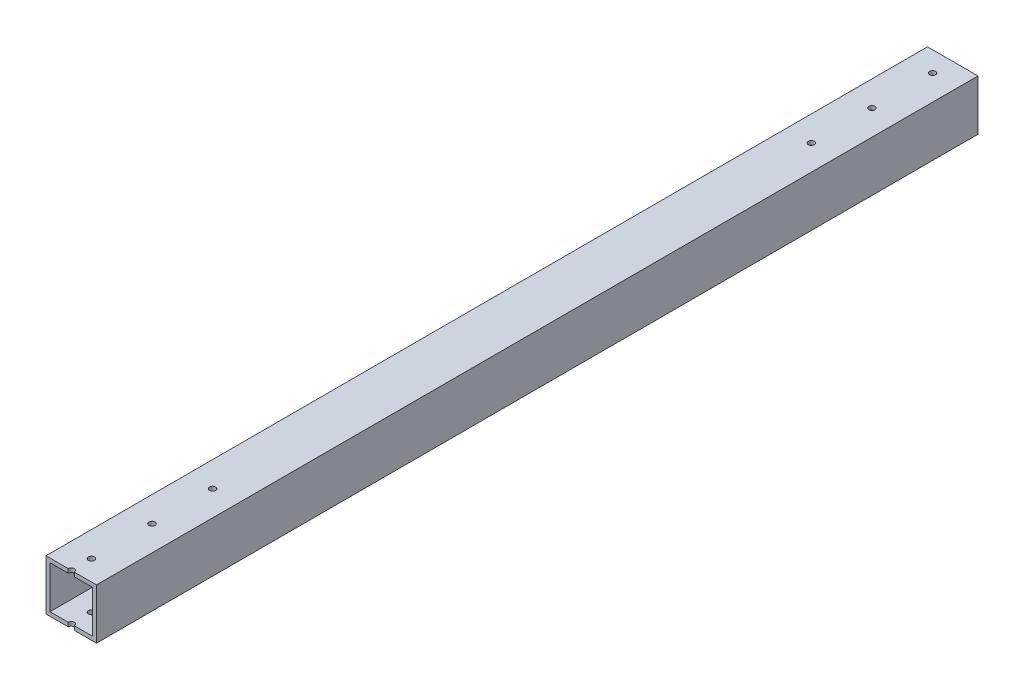
ISO-10303-21;
HEADER;
FILE_DESCRIPTION(('STEP AP214'),'2;1');
FILE_NAME('part.step','',(''),(''),'','','');
FILE_SCHEMA(('AUTOMOTIVE_DESIGN { 1 0 10303 214 1 1 1 1 }'));
ENDSEC;
DATA;
#1=APPLICATION_CONTEXT('core data for automotive mechanical design processes');
#2=APPLICATION_PROTOCOL_DEFINITION('international standard','automotive_design',2000,#1);
#3=PRODUCT_CONTEXT('',#1,'mechanical');
#4=PRODUCT('Part','Part','',(#3));
#5=PRODUCT_RELATED_PRODUCT_CATEGORY('part','',(#4));
#6=PRODUCT_DEFINITION_FORMATION('','',#4);
#7=PRODUCT_DEFINITION_CONTEXT('part definition',#1,'design');
#8=PRODUCT_DEFINITION('design','',#6,#7);
#9=PRODUCT_DEFINITION_SHAPE('','',#8);
#10=(LENGTH_UNIT() NAMED_UNIT(*) SI_UNIT(.MILLI.,.METRE.));
#11=(NAMED_UNIT(*) PLANE_ANGLE_UNIT() SI_UNIT($,.RADIAN.));
#12=(NAMED_UNIT(*) SI_UNIT($,.STERADIAN.) SOLID_ANGLE_UNIT());
#13=UNCERTAINTY_MEASURE_WITH_UNIT(LENGTH_MEASURE(1.E-05),#10,'distance_accuracy_value','');
#14=(GEOMETRIC_REPRESENTATION_CONTEXT(3) GLOBAL_UNCERTAINTY_ASSIGNED_CONTEXT((#13)) GLOBAL_UNIT_ASSIGNED_CONTEXT((#10,
#11,#12)) REPRESENTATION_CONTEXT('',''));
#15=CARTESIAN_POINT('',(0.,0.,0.));
#16=DIRECTION('',(0.,0.,1.));
#17=DIRECTION('',(1.,0.,0.));
#18=AXIS2_PLACEMENT_3D('',#15,#16,#17);
#19=CARTESIAN_POINT('',(0.,0.,0.));
#20=DIRECTION('',(0.,0.,-1.));
#21=DIRECTION('',(-1.,0.,0.));
#22=AXIS2_PLACEMENT_3D('',#19,#20,#21);
#23=PLANE('',#22);
#24=DIRECTION('',(1.,0.,0.));
#25=VECTOR('',#24,1.);
#26=CARTESIAN_POINT('',(-12.5,-12.5,0.));
#27=LINE('',#26,#25);
#28=CARTESIAN_POINT('',(-12.5,-12.5,0.));
#29=VERTEX_POINT('',#28);
#30=CARTESIAN_POINT('',(-1.5,-12.5,0.));
#31=VERTEX_POINT('',#30);
#32=EDGE_CURVE('E269',#29,#31,#27,.T.);
#33=ORIENTED_EDGE('',*,*,#32,.T.);
#34=DIRECTION('',(0.,1.,0.));
#35=VECTOR('',#34,1.);
#36=CARTESIAN_POINT('',(-1.5,-416.5,0.));
#37=LINE('',#36,#35);
#38=CARTESIAN_POINT('',(-1.5,-10.5,0.));
#39=VERTEX_POINT('',#38);
#40=EDGE_CURVE('E195',#31,#39,#37,.T.);
#41=ORIENTED_EDGE('',*,*,#40,.T.);
#42=DIRECTION('',(1.,0.,0.));
#43=VECTOR('',#42,1.);
#44=CARTESIAN_POINT('',(-10.5,-10.5,0.));
#45=LINE('',#44,#43);
#46=CARTESIAN_POINT('',(-10.5,-10.5,0.));
#47=VERTEX_POINT('',#46);
#48=EDGE_CURVE('E241',#47,#39,#45,.T.);
#49=ORIENTED_EDGE('',*,*,#48,.F.);
#50=DIRECTION('',(0.,-1.,0.));
#51=VECTOR('',#50,1.);
#52=CARTESIAN_POINT('',(-10.5,-10.5,0.));
#53=LINE('',#52,#51);
#54=CARTESIAN_POINT('',(-10.5,10.5,0.));
#55=VERTEX_POINT('',#54);
#56=EDGE_CURVE('E224',#55,#47,#53,.T.);
#57=ORIENTED_EDGE('',*,*,#56,.F.);
#58=DIRECTION('',(-1.,0.,0.));
#59=VECTOR('',#58,1.);
#60=CARTESIAN_POINT('',(-10.5,10.5,0.));
#61=LINE('',#60,#59);
#62=CARTESIAN_POINT('',(-1.5,10.5,0.));
#63=VERTEX_POINT('',#62);
#64=EDGE_CURVE('E247',#63,#55,#61,.T.);
#65=ORIENTED_EDGE('',*,*,#64,.F.);
#66=CARTESIAN_POINT('',(-1.5,12.5,0.));
#67=VERTEX_POINT('',#66);
#68=EDGE_CURVE('E49',#63,#67,#37,.T.);
#69=ORIENTED_EDGE('',*,*,#68,.T.);
#70=DIRECTION('',(-1.,0.,0.));
#71=VECTOR('',#70,1.);
#72=CARTESIAN_POINT('',(-12.5,12.5,0.));
#73=LINE('',#72,#71);
#74=CARTESIAN_POINT('',(-12.5,12.5,0.));
#75=VERTEX_POINT('',#74);
#76=EDGE_CURVE('E137',#67,#75,#73,.T.);
#77=ORIENTED_EDGE('',*,*,#76,.T.);
#78=DIRECTION('',(0.,-1.,0.));
#79=VECTOR('',#78,1.);
#80=CARTESIAN_POINT('',(-12.5,-12.5,0.));
#81=LINE('',#80,#79);
#82=EDGE_CURVE('E252',#75,#29,#81,.T.);
#83=ORIENTED_EDGE('',*,*,#82,.T.);
#84=EDGE_LOOP('',(#33,#41,#49,#57,#65,#69,#77,#83));
#85=FACE_BOUND('',#84,.T.);
#86=ADVANCED_FACE('F32',(#85),#23,.F.);
#87=CARTESIAN_POINT('',(-12.5,-12.5,-436.5));
#88=DIRECTION('',(-1.,0.,0.));
#89=DIRECTION('',(0.,-1.,0.));
#90=AXIS2_PLACEMENT_3D('',#87,#88,#89);
#91=PLANE('',#90);
#92=ORIENTED_EDGE('',*,*,#82,.F.);
#93=DIRECTION('',(0.,0.,1.));
#94=VECTOR('',#93,1.);
#95=CARTESIAN_POINT('',(-12.5,12.5,-436.5));
#96=LINE('',#95,#94);
#97=CARTESIAN_POINT('',(-12.5,12.5,-436.5));
#98=VERTEX_POINT('',#97);
#99=EDGE_CURVE('E41',#98,#75,#96,.T.);
#100=ORIENTED_EDGE('',*,*,#99,.F.);
#101=DIRECTION('',(0.,-1.,0.));
#102=VECTOR('',#101,1.);
#103=CARTESIAN_POINT('',(-12.5,-12.5,-436.5));
#104=LINE('',#103,#102);
#105=CARTESIAN_POINT('',(-12.5,-12.5,-436.5));
#106=VERTEX_POINT('',#105);
#107=EDGE_CURVE('E144',#98,#106,#104,.T.);
#108=ORIENTED_EDGE('',*,*,#107,.T.);
#109=DIRECTION('',(0.,0.,1.));
#110=VECTOR('',#109,1.);
#111=CARTESIAN_POINT('',(-12.5,-12.5,-436.5));
#112=LINE('',#111,#110);
#113=EDGE_CURVE('E158',#106,#29,#112,.T.);
#114=ORIENTED_EDGE('',*,*,#113,.T.);
#115=EDGE_LOOP('',(#92,#100,#108,#114));
#116=FACE_BOUND('',#115,.T.);
#117=ADVANCED_FACE('F34',(#116),#91,.T.);
#118=CARTESIAN_POINT('',(-12.5,12.5,-436.5));
#119=DIRECTION('',(0.,1.,0.));
#120=DIRECTION('',(0.,0.,1.));
#121=AXIS2_PLACEMENT_3D('',#118,#119,#120);
#122=PLANE('',#121);
#123=CARTESIAN_POINT('',(0.,12.5,-70.0000000000001));
#124=DIRECTION('',(0.,-1.,0.));
#125=DIRECTION('',(0.,0.,-1.));
#126=AXIS2_PLACEMENT_3D('',#123,#124,#125);
#127=CIRCLE('',#126,1.5);
#128=CARTESIAN_POINT('',(0.,12.5,-71.5000000000001));
#129=VERTEX_POINT('',#128);
#130=EDGE_CURVE('E539',#129,#129,#127,.T.);
#131=ORIENTED_EDGE('',*,*,#130,.T.);
#132=EDGE_LOOP('',(#131));
#133=FACE_BOUND('',#132,.T.);
#134=CARTESIAN_POINT('',(0.,12.5,-40.));
#135=DIRECTION('',(0.,-1.,0.));
#136=DIRECTION('',(0.,0.,-1.));
#137=AXIS2_PLACEMENT_3D('',#134,#135,#136);
#138=CIRCLE('',#137,1.5);
#139=CARTESIAN_POINT('',(0.,12.5,-41.5));
#140=VERTEX_POINT('',#139);
#141=EDGE_CURVE('E558',#140,#140,#138,.T.);
#142=ORIENTED_EDGE('',*,*,#141,.T.);
#143=EDGE_LOOP('',(#142));
#144=FACE_BOUND('',#143,.T.);
#145=CARTESIAN_POINT('',(0.,12.5,-10.));
#146=DIRECTION('',(0.,-1.,0.));
#147=DIRECTION('',(0.,0.,-1.));
#148=AXIS2_PLACEMENT_3D('',#145,#146,#147);
#149=CIRCLE('',#148,1.5);
#150=CARTESIAN_POINT('',(0.,12.5,-11.5));
#151=VERTEX_POINT('',#150);
#152=EDGE_CURVE('E190',#151,#151,#149,.T.);
#153=ORIENTED_EDGE('',*,*,#152,.T.);
#154=EDGE_LOOP('',(#153));
#155=FACE_BOUND('',#154,.T.);
#156=CARTESIAN_POINT('',(0.,12.5,0.));
#157=DIRECTION('',(0.,1.,0.));
#158=DIRECTION('',(0.,0.,1.));
#159=AXIS2_PLACEMENT_3D('',#156,#157,#158);
#160=CIRCLE('',#159,1.5);
#161=CARTESIAN_POINT('',(1.5,12.5,0.));
#162=VERTEX_POINT('',#161);
#163=EDGE_CURVE('E123',#162,#67,#160,.T.);
#164=ORIENTED_EDGE('',*,*,#163,.F.);
#165=CARTESIAN_POINT('',(12.5,12.5,0.));
#166=VERTEX_POINT('',#165);
#167=EDGE_CURVE('E135',#166,#162,#73,.T.);
#168=ORIENTED_EDGE('',*,*,#167,.F.);
#169=DIRECTION('',(0.,0.,1.));
#170=VECTOR('',#169,1.);
#171=CARTESIAN_POINT('',(12.5,12.5,-436.5));
#172=LINE('',#171,#170);
#173=CARTESIAN_POINT('',(12.5,12.5,-436.5));
#174=VERTEX_POINT('',#173);
#175=EDGE_CURVE('E153',#174,#166,#172,.T.);
#176=ORIENTED_EDGE('',*,*,#175,.F.);
#177=DIRECTION('',(-1.,0.,0.));
#178=VECTOR('',#177,1.);
#179=CARTESIAN_POINT('',(-12.5,12.5,-436.5));
#180=LINE('',#179,#178);
#181=EDGE_CURVE('E160',#174,#98,#180,.T.);
#182=ORIENTED_EDGE('',*,*,#181,.T.);
#183=ORIENTED_EDGE('',*,*,#99,.T.);
#184=ORIENTED_EDGE('',*,*,#76,.F.);
#185=EDGE_LOOP('',(#164,#168,#176,#182,#183,#184));
#186=FACE_BOUND('',#185,.T.);
#187=CARTESIAN_POINT('',(0.,12.5,-366.5));
#188=DIRECTION('',(0.,1.,0.));
#189=DIRECTION('',(0.,0.,1.));
#190=AXIS2_PLACEMENT_3D('',#187,#188,#189);
#191=CIRCLE('',#190,1.5);
#192=CARTESIAN_POINT('',(0.,12.5,-365.));
#193=VERTEX_POINT('',#192);
#194=EDGE_CURVE('E203',#193,#193,#191,.T.);
#195=ORIENTED_EDGE('',*,*,#194,.F.);
#196=EDGE_LOOP('',(#195));
#197=FACE_BOUND('',#196,.T.);
#198=CARTESIAN_POINT('',(0.,12.5,-396.5));
#199=DIRECTION('',(0.,1.,0.));
#200=DIRECTION('',(0.,0.,1.));
#201=AXIS2_PLACEMENT_3D('',#198,#199,#200);
#202=CIRCLE('',#201,1.5);
#203=CARTESIAN_POINT('',(0.,12.5,-395.));
#204=VERTEX_POINT('',#203);
#205=EDGE_CURVE('E206',#204,#204,#202,.T.);
#206=ORIENTED_EDGE('',*,*,#205,.F.);
#207=EDGE_LOOP('',(#206));
#208=FACE_BOUND('',#207,.T.);
#209=CARTESIAN_POINT('',(0.,12.5,-426.5));
#210=DIRECTION('',(0.,1.,0.));
#211=DIRECTION('',(0.,0.,1.));
#212=AXIS2_PLACEMENT_3D('',#209,#210,#211);
#213=CIRCLE('',#212,1.5);
#214=CARTESIAN_POINT('',(0.,12.5,-425.));
#215=VERTEX_POINT('',#214);
#216=EDGE_CURVE('E212',#215,#215,#213,.T.);
#217=ORIENTED_EDGE('',*,*,#216,.F.);
#218=EDGE_LOOP('',(#217));
#219=FACE_BOUND('',#218,.T.);
#220=ADVANCED_FACE('F133',(#133,#144,#155,#186,#197,#208,#219),#122,.T.);
#221=CARTESIAN_POINT('',(12.5,-12.5,-436.5));
#222=DIRECTION('',(1.,0.,0.));
#223=DIRECTION('',(0.,1.,0.));
#224=AXIS2_PLACEMENT_3D('',#221,#222,#223);
#225=PLANE('',#224);
#226=DIRECTION('',(0.,1.,0.));
#227=VECTOR('',#226,1.);
#228=CARTESIAN_POINT('',(12.5,-12.5,0.));
#229=LINE('',#228,#227);
#230=CARTESIAN_POINT('',(12.5,-12.5,0.));
#231=VERTEX_POINT('',#230);
#232=EDGE_CURVE('E143',#231,#166,#229,.T.);
#233=ORIENTED_EDGE('',*,*,#232,.F.);
#234=DIRECTION('',(0.,0.,1.));
#235=VECTOR('',#234,1.);
#236=CARTESIAN_POINT('',(12.5,-12.5,-436.5));
#237=LINE('',#236,#235);
#238=CARTESIAN_POINT('',(12.5,-12.5,-436.5));
#239=VERTEX_POINT('',#238);
#240=EDGE_CURVE('E155',#239,#231,#237,.T.);
#241=ORIENTED_EDGE('',*,*,#240,.F.);
#242=DIRECTION('',(0.,1.,0.));
#243=VECTOR('',#242,1.);
#244=CARTESIAN_POINT('',(12.5,-12.5,-436.5));
#245=LINE('',#244,#243);
#246=EDGE_CURVE('E262',#239,#174,#245,.T.);
#247=ORIENTED_EDGE('',*,*,#246,.T.);
#248=ORIENTED_EDGE('',*,*,#175,.T.);
#249=EDGE_LOOP('',(#233,#241,#247,#248));
#250=FACE_BOUND('',#249,.T.);
#251=ADVANCED_FACE('F282',(#250),#225,.T.);
#252=CARTESIAN_POINT('',(-12.5,-12.5,-436.5));
#253=DIRECTION('',(0.,-1.,0.));
#254=DIRECTION('',(1.,0.,0.));
#255=AXIS2_PLACEMENT_3D('',#252,#253,#254);
#256=PLANE('',#255);
#257=CARTESIAN_POINT('',(0.,-12.5,-70.0000000000001));
#258=DIRECTION('',(0.,-1.,0.));
#259=DIRECTION('',(0.,0.,-1.));
#260=AXIS2_PLACEMENT_3D('',#257,#258,#259);
#261=CIRCLE('',#260,1.5);
#262=CARTESIAN_POINT('',(0.,-12.5,-71.5000000000001));
#263=VERTEX_POINT('',#262);
#264=EDGE_CURVE('E177',#263,#263,#261,.T.);
#265=ORIENTED_EDGE('',*,*,#264,.F.);
#266=EDGE_LOOP('',(#265));
#267=FACE_BOUND('',#266,.T.);
#268=CARTESIAN_POINT('',(0.,-12.5,-40.));
#269=DIRECTION('',(0.,-1.,0.));
#270=DIRECTION('',(0.,0.,-1.));
#271=AXIS2_PLACEMENT_3D('',#268,#269,#270);
#272=CIRCLE('',#271,1.5);
#273=CARTESIAN_POINT('',(0.,-12.5,-41.5));
#274=VERTEX_POINT('',#273);
#275=EDGE_CURVE('E553',#274,#274,#272,.T.);
#276=ORIENTED_EDGE('',*,*,#275,.F.);
#277=EDGE_LOOP('',(#276));
#278=FACE_BOUND('',#277,.T.);
#279=CARTESIAN_POINT('',(0.,-12.5,-10.));
#280=DIRECTION('',(0.,-1.,0.));
#281=DIRECTION('',(0.,0.,-1.));
#282=AXIS2_PLACEMENT_3D('',#279,#280,#281);
#283=CIRCLE('',#282,1.5);
#284=CARTESIAN_POINT('',(0.,-12.5,-11.5));
#285=VERTEX_POINT('',#284);
#286=EDGE_CURVE('E562',#285,#285,#283,.T.);
#287=ORIENTED_EDGE('',*,*,#286,.F.);
#288=EDGE_LOOP('',(#287));
#289=FACE_BOUND('',#288,.T.);
#290=CARTESIAN_POINT('',(0.,-12.5,0.));
#291=DIRECTION('',(0.,-1.,0.));
#292=DIRECTION('',(1.,0.,0.));
#293=AXIS2_PLACEMENT_3D('',#290,#291,#292);
#294=CIRCLE('',#293,1.5);
#295=CARTESIAN_POINT('',(1.5,-12.5,0.));
#296=VERTEX_POINT('',#295);
#297=EDGE_CURVE('E198',#31,#296,#294,.T.);
#298=ORIENTED_EDGE('',*,*,#297,.F.);
#299=ORIENTED_EDGE('',*,*,#32,.F.);
#300=ORIENTED_EDGE('',*,*,#113,.F.);
#301=DIRECTION('',(1.,0.,0.));
#302=VECTOR('',#301,1.);
#303=CARTESIAN_POINT('',(-12.5,-12.5,-436.5));
#304=LINE('',#303,#302);
#305=EDGE_CURVE('E147',#106,#239,#304,.T.);
#306=ORIENTED_EDGE('',*,*,#305,.T.);
#307=ORIENTED_EDGE('',*,*,#240,.T.);
#308=EDGE_CURVE('E268',#296,#231,#27,.T.);
#309=ORIENTED_EDGE('',*,*,#308,.F.);
#310=EDGE_LOOP('',(#298,#299,#300,#306,#307,#309));
#311=FACE_BOUND('',#310,.T.);
#312=CARTESIAN_POINT('',(0.,-12.5,-366.5));
#313=DIRECTION('',(0.,1.,0.));
#314=DIRECTION('',(0.,0.,1.));
#315=AXIS2_PLACEMENT_3D('',#312,#313,#314);
#316=CIRCLE('',#315,1.5);
#317=CARTESIAN_POINT('',(0.,-12.5,-365.));
#318=VERTEX_POINT('',#317);
#319=EDGE_CURVE('E165',#318,#318,#316,.T.);
#320=ORIENTED_EDGE('',*,*,#319,.T.);
#321=EDGE_LOOP('',(#320));
#322=FACE_BOUND('',#321,.T.);
#323=CARTESIAN_POINT('',(0.,-12.5,-396.5));
#324=DIRECTION('',(0.,1.,0.));
#325=DIRECTION('',(0.,0.,1.));
#326=AXIS2_PLACEMENT_3D('',#323,#324,#325);
#327=CIRCLE('',#326,1.5);
#328=CARTESIAN_POINT('',(0.,-12.5,-395.));
#329=VERTEX_POINT('',#328);
#330=EDGE_CURVE('E209',#329,#329,#327,.T.);
#331=ORIENTED_EDGE('',*,*,#330,.T.);
#332=EDGE_LOOP('',(#331));
#333=FACE_BOUND('',#332,.T.);
#334=CARTESIAN_POINT('',(0.,-12.5,-426.5));
#335=DIRECTION('',(0.,1.,0.));
#336=DIRECTION('',(0.,0.,1.));
#337=AXIS2_PLACEMENT_3D('',#334,#335,#336);
#338=CIRCLE('',#337,1.5);
#339=CARTESIAN_POINT('',(0.,-12.5,-425.));
#340=VERTEX_POINT('',#339);
#341=EDGE_CURVE('E215',#340,#340,#338,.T.);
#342=ORIENTED_EDGE('',*,*,#341,.T.);
#343=EDGE_LOOP('',(#342));
#344=FACE_BOUND('',#343,.T.);
#345=ADVANCED_FACE('F277',(#267,#278,#289,#311,#322,#333,#344),#256,.T.);
#346=CARTESIAN_POINT('',(0.,0.,-436.5));
#347=DIRECTION('',(0.,0.,-1.));
#348=DIRECTION('',(-1.,0.,0.));
#349=AXIS2_PLACEMENT_3D('',#346,#347,#348);
#350=PLANE('',#349);
#351=DIRECTION('',(0.,-1.,0.));
#352=VECTOR('',#351,1.);
#353=CARTESIAN_POINT('',(-10.5,-10.5,-436.5));
#354=LINE('',#353,#352);
#355=CARTESIAN_POINT('',(-10.5,10.5,-436.5));
#356=VERTEX_POINT('',#355);
#357=CARTESIAN_POINT('',(-10.5,-10.5,-436.5));
#358=VERTEX_POINT('',#357);
#359=EDGE_CURVE('E225',#356,#358,#354,.T.);
#360=ORIENTED_EDGE('',*,*,#359,.T.);
#361=DIRECTION('',(1.,0.,0.));
#362=VECTOR('',#361,1.);
#363=CARTESIAN_POINT('',(-10.5,-10.5,-436.5));
#364=LINE('',#363,#362);
#365=CARTESIAN_POINT('',(10.5,-10.5,-436.5));
#366=VERTEX_POINT('',#365);
#367=EDGE_CURVE('E228',#358,#366,#364,.T.);
#368=ORIENTED_EDGE('',*,*,#367,.T.);
#369=DIRECTION('',(0.,1.,0.));
#370=VECTOR('',#369,1.);
#371=CARTESIAN_POINT('',(10.5,-10.5,-436.5));
#372=LINE('',#371,#370);
#373=CARTESIAN_POINT('',(10.5,10.5,-436.5));
#374=VERTEX_POINT('',#373);
#375=EDGE_CURVE('E232',#366,#374,#372,.T.);
#376=ORIENTED_EDGE('',*,*,#375,.T.);
#377=DIRECTION('',(-1.,0.,0.));
#378=VECTOR('',#377,1.);
#379=CARTESIAN_POINT('',(-10.5,10.5,-436.5));
#380=LINE('',#379,#378);
#381=EDGE_CURVE('E235',#374,#356,#380,.T.);
#382=ORIENTED_EDGE('',*,*,#381,.T.);
#383=EDGE_LOOP('',(#360,#368,#376,#382));
#384=FACE_BOUND('',#383,.T.);
#385=ORIENTED_EDGE('',*,*,#107,.F.);
#386=ORIENTED_EDGE('',*,*,#181,.F.);
#387=ORIENTED_EDGE('',*,*,#246,.F.);
#388=ORIENTED_EDGE('',*,*,#305,.F.);
#389=EDGE_LOOP('',(#385,#386,#387,#388));
#390=FACE_BOUND('',#389,.T.);
#391=ADVANCED_FACE('F287',(#384,#390),#350,.T.);
#392=ORIENTED_EDGE('',*,*,#167,.T.);
#393=DIRECTION('',(0.,1.,0.));
#394=VECTOR('',#393,1.);
#395=CARTESIAN_POINT('',(1.5,-416.5,0.));
#396=LINE('',#395,#394);
#397=CARTESIAN_POINT('',(1.5,10.5,0.));
#398=VERTEX_POINT('',#397);
#399=EDGE_CURVE('E120',#162,#398,#396,.F.);
#400=ORIENTED_EDGE('',*,*,#399,.T.);
#401=CARTESIAN_POINT('',(10.5,10.5,0.));
#402=VERTEX_POINT('',#401);
#403=EDGE_CURVE('E229',#402,#398,#61,.T.);
#404=ORIENTED_EDGE('',*,*,#403,.F.);
#405=DIRECTION('',(0.,1.,0.));
#406=VECTOR('',#405,1.);
#407=CARTESIAN_POINT('',(10.5,-10.5,0.));
#408=LINE('',#407,#406);
#409=CARTESIAN_POINT('',(10.5,-10.5,0.));
#410=VERTEX_POINT('',#409);
#411=EDGE_CURVE('E244',#410,#402,#408,.T.);
#412=ORIENTED_EDGE('',*,*,#411,.F.);
#413=CARTESIAN_POINT('',(1.5,-10.5,0.));
#414=VERTEX_POINT('',#413);
#415=EDGE_CURVE('E240',#414,#410,#45,.T.);
#416=ORIENTED_EDGE('',*,*,#415,.F.);
#417=EDGE_CURVE('E57',#414,#296,#396,.F.);
#418=ORIENTED_EDGE('',*,*,#417,.T.);
#419=ORIENTED_EDGE('',*,*,#308,.T.);
#420=ORIENTED_EDGE('',*,*,#232,.T.);
#421=EDGE_LOOP('',(#392,#400,#404,#412,#416,#418,#419,#420));
#422=FACE_BOUND('',#421,.T.);
#423=ADVANCED_FACE('F141',(#422),#23,.F.);
#424=CARTESIAN_POINT('',(-10.5,-10.5,-436.5));
#425=DIRECTION('',(-1.,0.,0.));
#426=DIRECTION('',(0.,-1.,0.));
#427=AXIS2_PLACEMENT_3D('',#424,#425,#426);
#428=PLANE('',#427);
#429=ORIENTED_EDGE('',*,*,#56,.T.);
#430=DIRECTION('',(0.,0.,1.));
#431=VECTOR('',#430,1.);
#432=CARTESIAN_POINT('',(-10.5,-10.5,-436.5));
#433=LINE('',#432,#431);
#434=EDGE_CURVE('E238',#358,#47,#433,.T.);
#435=ORIENTED_EDGE('',*,*,#434,.F.);
#436=ORIENTED_EDGE('',*,*,#359,.F.);
#437=DIRECTION('',(0.,0.,1.));
#438=VECTOR('',#437,1.);
#439=CARTESIAN_POINT('',(-10.5,10.5,-436.5));
#440=LINE('',#439,#438);
#441=EDGE_CURVE('E249',#356,#55,#440,.T.);
#442=ORIENTED_EDGE('',*,*,#441,.T.);
#443=EDGE_LOOP('',(#429,#435,#436,#442));
#444=FACE_BOUND('',#443,.T.);
#445=ADVANCED_FACE('F297',(#444),#428,.F.);
#446=CARTESIAN_POINT('',(-10.5,10.5,-436.5));
#447=DIRECTION('',(0.,1.,0.));
#448=DIRECTION('',(-1.,0.,0.));
#449=AXIS2_PLACEMENT_3D('',#446,#447,#448);
#450=PLANE('',#449);
#451=CARTESIAN_POINT('',(0.,10.5,-70.0000000000001));
#452=DIRECTION('',(0.,1.,0.));
#453=DIRECTION('',(-1.,0.,0.));
#454=AXIS2_PLACEMENT_3D('',#451,#452,#453);
#455=CIRCLE('',#454,1.5);
#456=CARTESIAN_POINT('',(-1.5,10.5,-70.0000000000001));
#457=VERTEX_POINT('',#456);
#458=EDGE_CURVE('E138',#457,#457,#455,.F.);
#459=ORIENTED_EDGE('',*,*,#458,.F.);
#460=EDGE_LOOP('',(#459));
#461=FACE_BOUND('',#460,.T.);
#462=CARTESIAN_POINT('',(0.,10.5,-40.));
#463=DIRECTION('',(0.,1.,0.));
#464=DIRECTION('',(-1.,0.,0.));
#465=AXIS2_PLACEMENT_3D('',#462,#463,#464);
#466=CIRCLE('',#465,1.5);
#467=CARTESIAN_POINT('',(-1.5,10.5,-40.));
#468=VERTEX_POINT('',#467);
#469=EDGE_CURVE('E180',#468,#468,#466,.F.);
#470=ORIENTED_EDGE('',*,*,#469,.F.);
#471=EDGE_LOOP('',(#470));
#472=FACE_BOUND('',#471,.T.);
#473=CARTESIAN_POINT('',(0.,10.5,-10.));
#474=DIRECTION('',(0.,1.,0.));
#475=DIRECTION('',(-1.,0.,0.));
#476=AXIS2_PLACEMENT_3D('',#473,#474,#475);
#477=CIRCLE('',#476,1.5);
#478=CARTESIAN_POINT('',(-1.5,10.5,-10.));
#479=VERTEX_POINT('',#478);
#480=EDGE_CURVE('E176',#479,#479,#477,.F.);
#481=ORIENTED_EDGE('',*,*,#480,.F.);
#482=EDGE_LOOP('',(#481));
#483=FACE_BOUND('',#482,.T.);
#484=CARTESIAN_POINT('',(0.,10.5,-366.5));
#485=DIRECTION('',(0.,1.,0.));
#486=DIRECTION('',(-1.,0.,0.));
#487=AXIS2_PLACEMENT_3D('',#484,#485,#486);
#488=CIRCLE('',#487,1.5);
#489=CARTESIAN_POINT('',(-1.5,10.5,-366.5));
#490=VERTEX_POINT('',#489);
#491=EDGE_CURVE('E172',#490,#490,#488,.T.);
#492=ORIENTED_EDGE('',*,*,#491,.T.);
#493=EDGE_LOOP('',(#492));
#494=FACE_BOUND('',#493,.T.);
#495=CARTESIAN_POINT('',(0.,10.5,-396.5));
#496=DIRECTION('',(0.,1.,0.));
#497=DIRECTION('',(-1.,0.,0.));
#498=AXIS2_PLACEMENT_3D('',#495,#496,#497);
#499=CIRCLE('',#498,1.5);
#500=CARTESIAN_POINT('',(-1.5,10.5,-396.5));
#501=VERTEX_POINT('',#500);
#502=EDGE_CURVE('E169',#501,#501,#499,.T.);
#503=ORIENTED_EDGE('',*,*,#502,.T.);
#504=EDGE_LOOP('',(#503));
#505=FACE_BOUND('',#504,.T.);
#506=CARTESIAN_POINT('',(0.,10.5,-426.5));
#507=DIRECTION('',(0.,1.,0.));
#508=DIRECTION('',(-1.,0.,0.));
#509=AXIS2_PLACEMENT_3D('',#506,#507,#508);
#510=CIRCLE('',#509,1.5);
#511=CARTESIAN_POINT('',(-1.5,10.5,-426.5));
#512=VERTEX_POINT('',#511);
#513=EDGE_CURVE('E164',#512,#512,#510,.T.);
#514=ORIENTED_EDGE('',*,*,#513,.T.);
#515=EDGE_LOOP('',(#514));
#516=FACE_BOUND('',#515,.T.);
#517=ORIENTED_EDGE('',*,*,#403,.T.);
#518=CARTESIAN_POINT('',(0.,10.5,0.));
#519=DIRECTION('',(0.,1.,0.));
#520=DIRECTION('',(-1.,0.,0.));
#521=AXIS2_PLACEMENT_3D('',#518,#519,#520);
#522=CIRCLE('',#521,1.5);
#523=EDGE_CURVE('E124',#398,#63,#522,.T.);
#524=ORIENTED_EDGE('',*,*,#523,.T.);
#525=ORIENTED_EDGE('',*,*,#64,.T.);
#526=ORIENTED_EDGE('',*,*,#441,.F.);
#527=ORIENTED_EDGE('',*,*,#381,.F.);
#528=DIRECTION('',(0.,0.,1.));
#529=VECTOR('',#528,1.);
#530=CARTESIAN_POINT('',(10.5,10.5,-436.5));
#531=LINE('',#530,#529);
#532=EDGE_CURVE('E253',#374,#402,#531,.T.);
#533=ORIENTED_EDGE('',*,*,#532,.T.);
#534=EDGE_LOOP('',(#517,#524,#525,#526,#527,#533));
#535=FACE_BOUND('',#534,.T.);
#536=ADVANCED_FACE('F293',(#461,#472,#483,#494,#505,#516,#535),#450,.F.);
#537=CARTESIAN_POINT('',(10.5,-10.5,-436.5));
#538=DIRECTION('',(1.,0.,0.));
#539=DIRECTION('',(0.,1.,0.));
#540=AXIS2_PLACEMENT_3D('',#537,#538,#539);
#541=PLANE('',#540);
#542=ORIENTED_EDGE('',*,*,#411,.T.);
#543=ORIENTED_EDGE('',*,*,#532,.F.);
#544=ORIENTED_EDGE('',*,*,#375,.F.);
#545=DIRECTION('',(0.,0.,1.));
#546=VECTOR('',#545,1.);
#547=CARTESIAN_POINT('',(10.5,-10.5,-436.5));
#548=LINE('',#547,#546);
#549=EDGE_CURVE('E255',#366,#410,#548,.T.);
#550=ORIENTED_EDGE('',*,*,#549,.T.);
#551=EDGE_LOOP('',(#542,#543,#544,#550));
#552=FACE_BOUND('',#551,.T.);
#553=ADVANCED_FACE('F302',(#552),#541,.F.);
#554=CARTESIAN_POINT('',(-10.5,-10.5,-436.5));
#555=DIRECTION('',(0.,-1.,0.));
#556=DIRECTION('',(0.,0.,-1.));
#557=AXIS2_PLACEMENT_3D('',#554,#555,#556);
#558=PLANE('',#557);
#559=CARTESIAN_POINT('',(0.,-10.5,-70.0000000000001));
#560=DIRECTION('',(0.,-1.,0.));
#561=DIRECTION('',(0.,0.,-1.));
#562=AXIS2_PLACEMENT_3D('',#559,#560,#561);
#563=CIRCLE('',#562,1.5);
#564=CARTESIAN_POINT('',(0.,-10.5,-71.5000000000001));
#565=VERTEX_POINT('',#564);
#566=EDGE_CURVE('E36',#565,#565,#563,.F.);
#567=ORIENTED_EDGE('',*,*,#566,.F.);
#568=EDGE_LOOP('',(#567));
#569=FACE_BOUND('',#568,.T.);
#570=CARTESIAN_POINT('',(0.,-10.5,-40.));
#571=DIRECTION('',(0.,-1.,0.));
#572=DIRECTION('',(0.,0.,-1.));
#573=AXIS2_PLACEMENT_3D('',#570,#571,#572);
#574=CIRCLE('',#573,1.5);
#575=CARTESIAN_POINT('',(0.,-10.5,-41.5));
#576=VERTEX_POINT('',#575);
#577=EDGE_CURVE('E178',#576,#576,#574,.F.);
#578=ORIENTED_EDGE('',*,*,#577,.F.);
#579=EDGE_LOOP('',(#578));
#580=FACE_BOUND('',#579,.T.);
#581=CARTESIAN_POINT('',(0.,-10.5,-10.));
#582=DIRECTION('',(0.,-1.,0.));
#583=DIRECTION('',(0.,0.,-1.));
#584=AXIS2_PLACEMENT_3D('',#581,#582,#583);
#585=CIRCLE('',#584,1.5);
#586=CARTESIAN_POINT('',(0.,-10.5,-11.5));
#587=VERTEX_POINT('',#586);
#588=EDGE_CURVE('E174',#587,#587,#585,.F.);
#589=ORIENTED_EDGE('',*,*,#588,.F.);
#590=EDGE_LOOP('',(#589));
#591=FACE_BOUND('',#590,.T.);
#592=CARTESIAN_POINT('',(0.,-10.5,-366.5));
#593=DIRECTION('',(0.,-1.,0.));
#594=DIRECTION('',(0.,0.,-1.));
#595=AXIS2_PLACEMENT_3D('',#592,#593,#594);
#596=CIRCLE('',#595,1.5);
#597=CARTESIAN_POINT('',(0.,-10.5,-368.));
#598=VERTEX_POINT('',#597);
#599=EDGE_CURVE('E170',#598,#598,#596,.T.);
#600=ORIENTED_EDGE('',*,*,#599,.T.);
#601=EDGE_LOOP('',(#600));
#602=FACE_BOUND('',#601,.T.);
#603=CARTESIAN_POINT('',(0.,-10.5,-396.5));
#604=DIRECTION('',(0.,-1.,0.));
#605=DIRECTION('',(0.,0.,-1.));
#606=AXIS2_PLACEMENT_3D('',#603,#604,#605);
#607=CIRCLE('',#606,1.5);
#608=CARTESIAN_POINT('',(0.,-10.5,-398.));
#609=VERTEX_POINT('',#608);
#610=EDGE_CURVE('E166',#609,#609,#607,.T.);
#611=ORIENTED_EDGE('',*,*,#610,.T.);
#612=EDGE_LOOP('',(#611));
#613=FACE_BOUND('',#612,.T.);
#614=CARTESIAN_POINT('',(0.,-10.5,-426.5));
#615=DIRECTION('',(0.,-1.,0.));
#616=DIRECTION('',(0.,0.,-1.));
#617=AXIS2_PLACEMENT_3D('',#614,#615,#616);
#618=CIRCLE('',#617,1.5);
#619=CARTESIAN_POINT('',(0.,-10.5,-428.));
#620=VERTEX_POINT('',#619);
#621=EDGE_CURVE('E161',#620,#620,#618,.T.);
#622=ORIENTED_EDGE('',*,*,#621,.T.);
#623=EDGE_LOOP('',(#622));
#624=FACE_BOUND('',#623,.T.);
#625=ORIENTED_EDGE('',*,*,#48,.T.);
#626=CARTESIAN_POINT('',(0.,-10.5,0.));
#627=DIRECTION('',(0.,-1.,0.));
#628=DIRECTION('',(0.,0.,-1.));
#629=AXIS2_PLACEMENT_3D('',#626,#627,#628);
#630=CIRCLE('',#629,1.5);
#631=EDGE_CURVE('E11',#39,#414,#630,.T.);
#632=ORIENTED_EDGE('',*,*,#631,.T.);
#633=ORIENTED_EDGE('',*,*,#415,.T.);
#634=ORIENTED_EDGE('',*,*,#549,.F.);
#635=ORIENTED_EDGE('',*,*,#367,.F.);
#636=ORIENTED_EDGE('',*,*,#434,.T.);
#637=EDGE_LOOP('',(#625,#632,#633,#634,#635,#636));
#638=FACE_BOUND('',#637,.T.);
#639=ADVANCED_FACE('F305',(#569,#580,#591,#602,#613,#624,#638),#558,.F.);
#640=CARTESIAN_POINT('',(0.,-12.5,-426.5));
#641=DIRECTION('',(0.,1.,0.));
#642=DIRECTION('',(0.,0.,1.));
#643=AXIS2_PLACEMENT_3D('',#640,#641,#642);
#644=CYLINDRICAL_SURFACE('',#643,1.5);
#645=ORIENTED_EDGE('',*,*,#341,.F.);
#646=EDGE_LOOP('',(#645));
#647=FACE_BOUND('',#646,.T.);
#648=ORIENTED_EDGE('',*,*,#621,.F.);
#649=EDGE_LOOP('',(#648));
#650=FACE_BOUND('',#649,.T.);
#651=ADVANCED_FACE('F340',(#647,#650),#644,.F.);
#652=CARTESIAN_POINT('',(0.,-12.5,-396.5));
#653=DIRECTION('',(0.,1.,0.));
#654=DIRECTION('',(0.,0.,1.));
#655=AXIS2_PLACEMENT_3D('',#652,#653,#654);
#656=CYLINDRICAL_SURFACE('',#655,1.5);
#657=ORIENTED_EDGE('',*,*,#330,.F.);
#658=EDGE_LOOP('',(#657));
#659=FACE_BOUND('',#658,.T.);
#660=ORIENTED_EDGE('',*,*,#610,.F.);
#661=EDGE_LOOP('',(#660));
#662=FACE_BOUND('',#661,.T.);
#663=ADVANCED_FACE('F353',(#659,#662),#656,.F.);
#664=CARTESIAN_POINT('',(0.,-12.5,-366.5));
#665=DIRECTION('',(0.,1.,0.));
#666=DIRECTION('',(0.,0.,1.));
#667=AXIS2_PLACEMENT_3D('',#664,#665,#666);
#668=CYLINDRICAL_SURFACE('',#667,1.5);
#669=ORIENTED_EDGE('',*,*,#319,.F.);
#670=EDGE_LOOP('',(#669));
#671=FACE_BOUND('',#670,.T.);
#672=ORIENTED_EDGE('',*,*,#599,.F.);
#673=EDGE_LOOP('',(#672));
#674=FACE_BOUND('',#673,.T.);
#675=ADVANCED_FACE('F318',(#671,#674),#668,.F.);
#676=ORIENTED_EDGE('',*,*,#216,.T.);
#677=EDGE_LOOP('',(#676));
#678=FACE_BOUND('',#677,.T.);
#679=ORIENTED_EDGE('',*,*,#513,.F.);
#680=EDGE_LOOP('',(#679));
#681=FACE_BOUND('',#680,.T.);
#682=ADVANCED_FACE('F347',(#678,#681),#644,.F.);
#683=ORIENTED_EDGE('',*,*,#205,.T.);
#684=EDGE_LOOP('',(#683));
#685=FACE_BOUND('',#684,.T.);
#686=ORIENTED_EDGE('',*,*,#502,.F.);
#687=EDGE_LOOP('',(#686));
#688=FACE_BOUND('',#687,.T.);
#689=ADVANCED_FACE('F315',(#685,#688),#656,.F.);
#690=ORIENTED_EDGE('',*,*,#194,.T.);
#691=EDGE_LOOP('',(#690));
#692=FACE_BOUND('',#691,.T.);
#693=ORIENTED_EDGE('',*,*,#491,.F.);
#694=EDGE_LOOP('',(#693));
#695=FACE_BOUND('',#694,.T.);
#696=ADVANCED_FACE('F308',(#692,#695),#668,.F.);
#697=CARTESIAN_POINT('',(0.,-416.5,0.));
#698=DIRECTION('',(0.,1.,0.));
#699=DIRECTION('',(0.,0.,1.));
#700=AXIS2_PLACEMENT_3D('',#697,#698,#699);
#701=CYLINDRICAL_SURFACE('',#700,1.5);
#702=ORIENTED_EDGE('',*,*,#297,.T.);
#703=ORIENTED_EDGE('',*,*,#417,.F.);
#704=ORIENTED_EDGE('',*,*,#631,.F.);
#705=ORIENTED_EDGE('',*,*,#40,.F.);
#706=EDGE_LOOP('',(#702,#703,#704,#705));
#707=FACE_BOUND('',#706,.T.);
#708=ADVANCED_FACE('F306',(#707),#701,.F.);
#709=ORIENTED_EDGE('',*,*,#523,.F.);
#710=ORIENTED_EDGE('',*,*,#399,.F.);
#711=ORIENTED_EDGE('',*,*,#163,.T.);
#712=ORIENTED_EDGE('',*,*,#68,.F.);
#713=EDGE_LOOP('',(#709,#710,#711,#712));
#714=FACE_BOUND('',#713,.T.);
#715=ADVANCED_FACE('F122',(#714),#701,.F.);
#716=CARTESIAN_POINT('',(0.,-12.5,-10.));
#717=DIRECTION('',(0.,1.,0.));
#718=DIRECTION('',(0.,0.,1.));
#719=AXIS2_PLACEMENT_3D('',#716,#717,#718);
#720=CYLINDRICAL_SURFACE('',#719,1.5);
#721=ORIENTED_EDGE('',*,*,#286,.T.);
#722=EDGE_LOOP('',(#721));
#723=FACE_BOUND('',#722,.T.);
#724=ORIENTED_EDGE('',*,*,#588,.T.);
#725=EDGE_LOOP('',(#724));
#726=FACE_BOUND('',#725,.T.);
#727=ADVANCED_FACE('F314',(#723,#726),#720,.F.);
#728=CARTESIAN_POINT('',(0.,-12.5,-40.));
#729=DIRECTION('',(0.,1.,0.));
#730=DIRECTION('',(0.,0.,1.));
#731=AXIS2_PLACEMENT_3D('',#728,#729,#730);
#732=CYLINDRICAL_SURFACE('',#731,1.5);
#733=ORIENTED_EDGE('',*,*,#275,.T.);
#734=EDGE_LOOP('',(#733));
#735=FACE_BOUND('',#734,.T.);
#736=ORIENTED_EDGE('',*,*,#577,.T.);
#737=EDGE_LOOP('',(#736));
#738=FACE_BOUND('',#737,.T.);
#739=ADVANCED_FACE('F486',(#735,#738),#732,.F.);
#740=CARTESIAN_POINT('',(0.,-12.5,-70.0000000000001));
#741=DIRECTION('',(0.,1.,0.));
#742=DIRECTION('',(0.,0.,1.));
#743=AXIS2_PLACEMENT_3D('',#740,#741,#742);
#744=CYLINDRICAL_SURFACE('',#743,1.5);
#745=ORIENTED_EDGE('',*,*,#264,.T.);
#746=EDGE_LOOP('',(#745));
#747=FACE_BOUND('',#746,.T.);
#748=ORIENTED_EDGE('',*,*,#566,.T.);
#749=EDGE_LOOP('',(#748));
#750=FACE_BOUND('',#749,.T.);
#751=ADVANCED_FACE('F493',(#747,#750),#744,.F.);
#752=ORIENTED_EDGE('',*,*,#152,.F.);
#753=EDGE_LOOP('',(#752));
#754=FACE_BOUND('',#753,.T.);
#755=ORIENTED_EDGE('',*,*,#480,.T.);
#756=EDGE_LOOP('',(#755));
#757=FACE_BOUND('',#756,.T.);
#758=ADVANCED_FACE('F488',(#754,#757),#720,.F.);
#759=ORIENTED_EDGE('',*,*,#141,.F.);
#760=EDGE_LOOP('',(#759));
#761=FACE_BOUND('',#760,.T.);
#762=ORIENTED_EDGE('',*,*,#469,.T.);
#763=EDGE_LOOP('',(#762));
#764=FACE_BOUND('',#763,.T.);
#765=ADVANCED_FACE('F496',(#761,#764),#732,.F.);
#766=ORIENTED_EDGE('',*,*,#130,.F.);
#767=EDGE_LOOP('',(#766));
#768=FACE_BOUND('',#767,.T.);
#769=ORIENTED_EDGE('',*,*,#458,.T.);
#770=EDGE_LOOP('',(#769));
#771=FACE_BOUND('',#770,.T.);
#772=ADVANCED_FACE('F504',(#768,#771),#744,.F.);
#773=CLOSED_SHELL('',(#86,#117,#220,#251,#345,#391,#423,#445,#536,#553,#639,#651,#663,#675,#682,
#689,#696,#708,#715,#727,#739,#751,#758,#765,#772));
#774=MANIFOLD_SOLID_BREP('B2',#773);
#775=ADVANCED_BREP_SHAPE_REPRESENTATION('',(#18,#774),#14);
#776=SHAPE_DEFINITION_REPRESENTATION(#9,#775);
ENDSEC;
END-ISO-10303-21;
